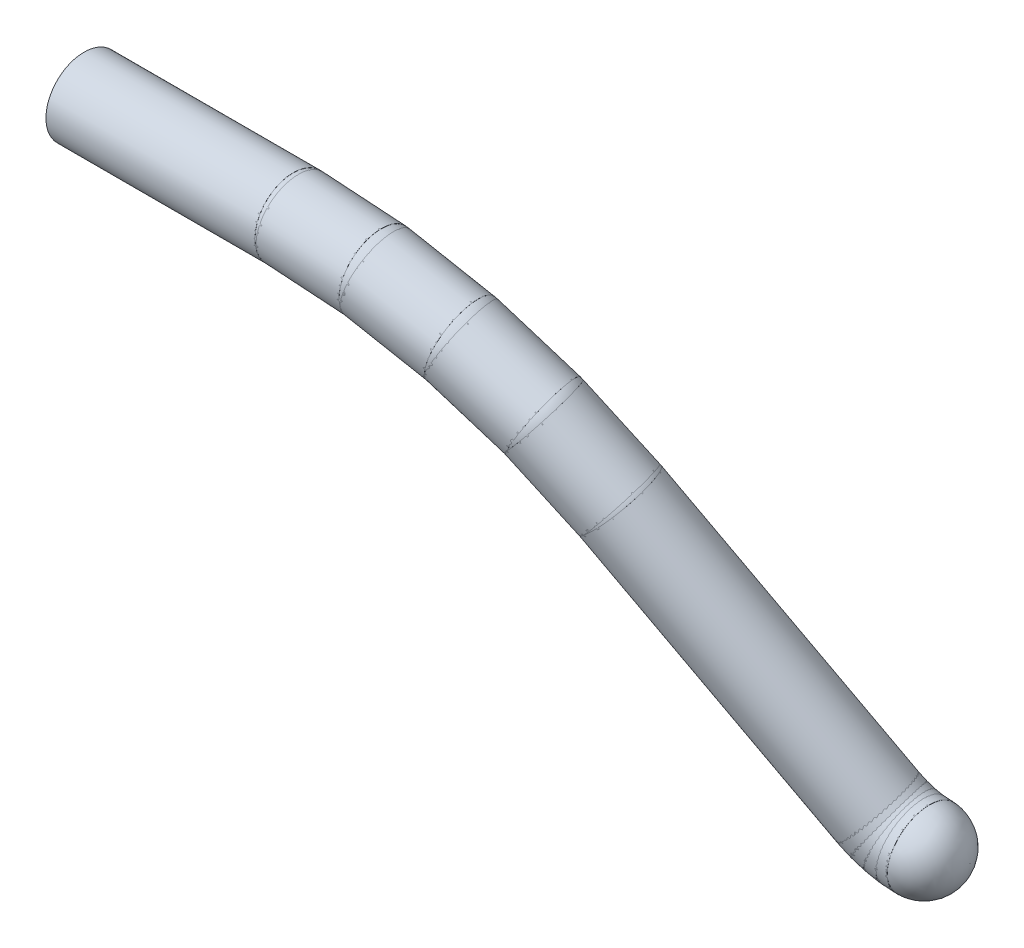
ISO-10303-21;
HEADER;
FILE_DESCRIPTION(('STEP AP214'),'2;1');
FILE_NAME('part.step','',(''),(''),'','','');
FILE_SCHEMA(('AUTOMOTIVE_DESIGN { 1 0 10303 214 1 1 1 1 }'));
ENDSEC;
DATA;
#1=APPLICATION_CONTEXT('core data for automotive mechanical design processes');
#2=APPLICATION_PROTOCOL_DEFINITION('international standard','automotive_design',2000,#1);
#3=PRODUCT_CONTEXT('',#1,'mechanical');
#4=PRODUCT('Part','Part','',(#3));
#5=PRODUCT_RELATED_PRODUCT_CATEGORY('part','',(#4));
#6=PRODUCT_DEFINITION_FORMATION('','',#4);
#7=PRODUCT_DEFINITION_CONTEXT('part definition',#1,'design');
#8=PRODUCT_DEFINITION('design','',#6,#7);
#9=PRODUCT_DEFINITION_SHAPE('','',#8);
#10=(LENGTH_UNIT() NAMED_UNIT(*) SI_UNIT(.MILLI.,.METRE.));
#11=(NAMED_UNIT(*) PLANE_ANGLE_UNIT() SI_UNIT($,.RADIAN.));
#12=(NAMED_UNIT(*) SI_UNIT($,.STERADIAN.) SOLID_ANGLE_UNIT());
#13=UNCERTAINTY_MEASURE_WITH_UNIT(LENGTH_MEASURE(1.E-05),#10,'distance_accuracy_value','');
#14=(GEOMETRIC_REPRESENTATION_CONTEXT(3) GLOBAL_UNCERTAINTY_ASSIGNED_CONTEXT((#13)) GLOBAL_UNIT_ASSIGNED_CONTEXT((#10,
#11,#12)) REPRESENTATION_CONTEXT('',''));
#15=CARTESIAN_POINT('',(0.,0.,0.));
#16=DIRECTION('',(0.,0.,1.));
#17=DIRECTION('',(1.,0.,0.));
#18=AXIS2_PLACEMENT_3D('',#15,#16,#17);
#19=CARTESIAN_POINT('',(59.8,-60.8,197.6));
#20=DIRECTION('',(-1.,0.,0.));
#21=DIRECTION('',(0.,0.,1.));
#22=AXIS2_PLACEMENT_3D('',#19,#20,#21);
#23=PLANE('',#22);
#24=CARTESIAN_POINT('',(59.8,-60.8,197.6));
#25=DIRECTION('',(-1.,0.,0.));
#26=DIRECTION('',(0.,0.,-1.));
#27=AXIS2_PLACEMENT_3D('',#24,#25,#26);
#28=CIRCLE('',#27,2.3);
#29=CARTESIAN_POINT('',(59.8,-60.8,195.3));
#30=VERTEX_POINT('',#29);
#31=EDGE_CURVE('P0_E11',#30,#30,#28,.T.);
#32=ORIENTED_EDGE('',*,*,#31,.F.);
#33=EDGE_LOOP('',(#32));
#34=FACE_BOUND('',#33,.T.);
#35=ADVANCED_FACE('P0_F16',(#34),#23,.F.);
#36=CARTESIAN_POINT('',(59.77,-60.8,197.6));
#37=DIRECTION('',(-1.,0.,0.));
#38=DIRECTION('',(0.,0.,1.));
#39=AXIS2_PLACEMENT_3D('',#36,#37,#38);
#40=PLANE('',#39);
#41=CARTESIAN_POINT('',(59.77,-60.8,197.6));
#42=DIRECTION('',(-1.,0.,0.));
#43=DIRECTION('',(0.,0.,-1.));
#44=AXIS2_PLACEMENT_3D('',#41,#42,#43);
#45=CIRCLE('',#44,2.3);
#46=CARTESIAN_POINT('',(59.77,-60.8,195.3));
#47=VERTEX_POINT('',#46);
#48=EDGE_CURVE('P0_E42',#47,#47,#45,.T.);
#49=ORIENTED_EDGE('',*,*,#48,.T.);
#50=EDGE_LOOP('',(#49));
#51=FACE_BOUND('',#50,.T.);
#52=ADVANCED_FACE('P0_F18',(#51),#40,.T.);
#53=CARTESIAN_POINT('',(59.8,-60.8,197.6));
#54=DIRECTION('',(-1.,0.,0.));
#55=DIRECTION('',(0.,0.,-1.));
#56=AXIS2_PLACEMENT_3D('',#53,#54,#55);
#57=CYLINDRICAL_SURFACE('',#56,2.3);
#58=ORIENTED_EDGE('',*,*,#48,.F.);
#59=DIRECTION('',(-1.,0.,0.));
#60=VECTOR('',#59,1.);
#61=CARTESIAN_POINT('',(59.8,-60.8,195.3));
#62=LINE('',#61,#60);
#63=EDGE_CURVE('P0_E20',#30,#47,#62,.T.);
#64=ORIENTED_EDGE('',*,*,#63,.F.);
#65=ORIENTED_EDGE('',*,*,#31,.T.);
#66=ORIENTED_EDGE('',*,*,#63,.T.);
#67=EDGE_LOOP('',(#58,#64,#65,#66));
#68=FACE_BOUND('',#67,.T.);
#69=ADVANCED_FACE('P0_F41',(#68),#57,.T.);
#70=CLOSED_SHELL('',(#35,#52,#69));
#71=MANIFOLD_SOLID_BREP('P0_B1',#70);
#72=CARTESIAN_POINT('',(59.77,-60.8,197.6));
#73=DIRECTION('',(-0.994377307166138,0.100509124393014,0.0333419691495447));
#74=DIRECTION('',(0.0335116676568446,0.,0.999438326326771));
#75=AXIS2_PLACEMENT_3D('',#72,#73,#74);
#76=PLANE('',#75);
#77=CARTESIAN_POINT('',(59.77,-60.8,197.6));
#78=DIRECTION('',(-0.994377307166163,0.100509124392765,0.0333419691495447));
#79=DIRECTION('',(-0.100565038355,-0.994930486547004,0.));
#80=AXIS2_PLACEMENT_3D('',#77,#78,#79);
#81=CIRCLE('',#80,2.3);
#82=CARTESIAN_POINT('',(59.538700411783,-63.08834011905,197.6));
#83=VERTEX_POINT('',#82);
#84=EDGE_CURVE('P1_E11',#83,#83,#81,.T.);
#85=ORIENTED_EDGE('',*,*,#84,.F.);
#86=EDGE_LOOP('',(#85));
#87=FACE_BOUND('',#86,.T.);
#88=ADVANCED_FACE('P1_F16',(#87),#76,.F.);
#89=CARTESIAN_POINT('',(59.084830912849,-60.73074485458,197.62297406266));
#90=DIRECTION('',(-0.994377307166138,0.100509124393014,0.0333419691495447));
#91=DIRECTION('',(0.0335116676568446,0.,0.999438326326771));
#92=AXIS2_PLACEMENT_3D('',#89,#90,#91);
#93=PLANE('',#92);
#94=CARTESIAN_POINT('',(59.084830912849,-60.73074485458,197.62297406266));
#95=DIRECTION('',(-0.994377307166163,0.100509124392765,0.0333419691495447));
#96=DIRECTION('',(-0.100565038355,-0.994930486547004,0.));
#97=AXIS2_PLACEMENT_3D('',#94,#95,#96);
#98=CIRCLE('',#97,2.3);
#99=CARTESIAN_POINT('',(58.853531324632,-63.01908497363,197.62297406266));
#100=VERTEX_POINT('',#99);
#101=EDGE_CURVE('P1_E20',#100,#100,#98,.T.);
#102=ORIENTED_EDGE('',*,*,#101,.T.);
#103=EDGE_LOOP('',(#102));
#104=FACE_BOUND('',#103,.T.);
#105=ADVANCED_FACE('P1_F44',(#104),#93,.T.);
#106=CARTESIAN_POINT('',(59.77,-60.8,197.6));
#107=DIRECTION('',(-0.994377307166163,0.100509124392765,0.0333419691495447));
#108=DIRECTION('',(-0.100565038355,-0.994930486547004,0.));
#109=AXIS2_PLACEMENT_3D('',#106,#107,#108);
#110=CYLINDRICAL_SURFACE('',#109,2.3);
#111=ORIENTED_EDGE('',*,*,#101,.F.);
#112=DIRECTION('',(-0.994377307166138,0.100509124393014,0.0333419691495447));
#113=VECTOR('',#112,1.);
#114=CARTESIAN_POINT('',(59.538700411783,-63.08834011905,197.6));
#115=LINE('',#114,#113);
#116=EDGE_CURVE('P1_E26',#83,#100,#115,.T.);
#117=ORIENTED_EDGE('',*,*,#116,.F.);
#118=ORIENTED_EDGE('',*,*,#84,.T.);
#119=ORIENTED_EDGE('',*,*,#116,.T.);
#120=EDGE_LOOP('',(#111,#117,#118,#119));
#121=FACE_BOUND('',#120,.T.);
#122=ADVANCED_FACE('P1_F18',(#121),#110,.T.);
#123=CLOSED_SHELL('',(#88,#105,#122));
#124=MANIFOLD_SOLID_BREP('P1_B1',#123);
#125=CARTESIAN_POINT('',(59.084830912849,-60.73074485458,197.62297406266));
#126=DIRECTION('',(-0.949774429553361,0.297019027964113,0.0985303506227474));
#127=DIRECTION('',(0.103187019804501,0.,0.994661972201544));
#128=AXIS2_PLACEMENT_3D('',#125,#126,#127);
#129=PLANE('',#128);
#130=CARTESIAN_POINT('',(59.084830912849,-60.73074485458,197.62297406266));
#131=DIRECTION('',(-0.949774429553291,0.297019027964335,0.0985303506227475));
#132=DIRECTION('',(-0.298471375875002,-0.954418586252009,0.));
#133=AXIS2_PLACEMENT_3D('',#130,#131,#132);
#134=CIRCLE('',#133,2.3);
#135=CARTESIAN_POINT('',(58.398346748337,-62.92590760295,197.62297406266));
#136=VERTEX_POINT('',#135);
#137=EDGE_CURVE('P2_E11',#136,#136,#134,.T.);
#138=ORIENTED_EDGE('',*,*,#137,.F.);
#139=EDGE_LOOP('',(#138));
#140=FACE_BOUND('',#139,.T.);
#141=ADVANCED_FACE('P2_F16',(#140),#129,.F.);
#142=CARTESIAN_POINT('',(58.430395142637,-60.52608586368,197.69086574714));
#143=DIRECTION('',(-0.949774429553361,0.297019027964113,0.0985303506227474));
#144=DIRECTION('',(0.103187019804501,0.,0.994661972201544));
#145=AXIS2_PLACEMENT_3D('',#142,#143,#144);
#146=PLANE('',#145);
#147=CARTESIAN_POINT('',(58.430395142637,-60.52608586368,197.69086574714));
#148=DIRECTION('',(-0.949774429553291,0.297019027964335,0.0985303506227475));
#149=DIRECTION('',(-0.298471375875002,-0.954418586252009,0.));
#150=AXIS2_PLACEMENT_3D('',#147,#148,#149);
#151=CIRCLE('',#150,2.3);
#152=CARTESIAN_POINT('',(57.743910978126,-62.72124861206,197.69086574714));
#153=VERTEX_POINT('',#152);
#154=EDGE_CURVE('P2_E19',#153,#153,#151,.T.);
#155=ORIENTED_EDGE('',*,*,#154,.T.);
#156=EDGE_LOOP('',(#155));
#157=FACE_BOUND('',#156,.T.);
#158=ADVANCED_FACE('P2_F44',(#157),#146,.T.);
#159=CARTESIAN_POINT('',(59.084830912849,-60.73074485458,197.62297406266));
#160=DIRECTION('',(-0.949774429553291,0.297019027964335,0.0985303506227475));
#161=DIRECTION('',(-0.298471375875002,-0.954418586252009,0.));
#162=AXIS2_PLACEMENT_3D('',#159,#160,#161);
#163=CYLINDRICAL_SURFACE('',#162,2.3);
#164=ORIENTED_EDGE('',*,*,#154,.F.);
#165=DIRECTION('',(-0.949774429553361,0.297019027964113,0.0985303506227474));
#166=VECTOR('',#165,1.);
#167=CARTESIAN_POINT('',(58.398346748337,-62.92590760295,197.62297406266));
#168=LINE('',#167,#166);
#169=EDGE_CURVE('P2_E25',#136,#153,#168,.T.);
#170=ORIENTED_EDGE('',*,*,#169,.F.);
#171=ORIENTED_EDGE('',*,*,#137,.T.);
#172=ORIENTED_EDGE('',*,*,#169,.T.);
#173=EDGE_LOOP('',(#164,#170,#171,#172));
#174=FACE_BOUND('',#173,.T.);
#175=ADVANCED_FACE('P2_F40',(#174),#163,.T.);
#176=CLOSED_SHELL('',(#141,#158,#175));
#177=MANIFOLD_SOLID_BREP('P2_B1',#176);
#178=CARTESIAN_POINT('',(58.430395142637,-60.52608586368,197.69086574714));
#179=DIRECTION('',(-0.8625693401485,0.480206118094722,0.159299144944908));
#180=DIRECTION('',(0.181608748444741,0.,0.983370867215587));
#181=AXIS2_PLACEMENT_3D('',#178,#179,#180);
#182=PLANE('',#181);
#183=CARTESIAN_POINT('',(58.430395142637,-60.52608586368,197.69086574714));
#184=DIRECTION('',(-0.86256934014843,0.480206118094849,0.159299144944907));
#185=DIRECTION('',(-0.486417494708771,-0.873726513756589,0.));
#186=AXIS2_PLACEMENT_3D('',#183,#184,#185);
#187=CIRCLE('',#186,2.3);
#188=CARTESIAN_POINT('',(57.311634904808,-62.53565684532,197.69086574714));
#189=VERTEX_POINT('',#188);
#190=EDGE_CURVE('P3_E11',#189,#189,#187,.T.);
#191=ORIENTED_EDGE('',*,*,#190,.F.);
#192=EDGE_LOOP('',(#191));
#193=FACE_BOUND('',#192,.T.);
#194=ADVANCED_FACE('P3_F16',(#193),#182,.F.);
#195=CARTESIAN_POINT('',(57.836047460792,-60.19520302352,197.80062976623));
#196=DIRECTION('',(-0.8625693401485,0.480206118094722,0.159299144944908));
#197=DIRECTION('',(0.181608748444741,0.,0.983370867215587));
#198=AXIS2_PLACEMENT_3D('',#195,#196,#197);
#199=PLANE('',#198);
#200=CARTESIAN_POINT('',(57.836047460792,-60.19520302352,197.80062976623));
#201=DIRECTION('',(-0.86256934014843,0.480206118094849,0.159299144944907));
#202=DIRECTION('',(-0.486417494708771,-0.873726513756589,0.));
#203=AXIS2_PLACEMENT_3D('',#200,#201,#202);
#204=CIRCLE('',#203,2.3);
#205=CARTESIAN_POINT('',(56.717287222962,-62.20477400516,197.80062976623));
#206=VERTEX_POINT('',#205);
#207=EDGE_CURVE('P3_E20',#206,#206,#204,.T.);
#208=ORIENTED_EDGE('',*,*,#207,.T.);
#209=EDGE_LOOP('',(#208));
#210=FACE_BOUND('',#209,.T.);
#211=ADVANCED_FACE('P3_F44',(#210),#199,.T.);
#212=CARTESIAN_POINT('',(58.430395142637,-60.52608586368,197.69086574714));
#213=DIRECTION('',(-0.86256934014843,0.480206118094849,0.159299144944907));
#214=DIRECTION('',(-0.486417494708771,-0.873726513756589,0.));
#215=AXIS2_PLACEMENT_3D('',#212,#213,#214);
#216=CYLINDRICAL_SURFACE('',#215,2.3);
#217=ORIENTED_EDGE('',*,*,#207,.F.);
#218=DIRECTION('',(-0.8625693401485,0.480206118094722,0.159299144944908));
#219=VECTOR('',#218,1.);
#220=CARTESIAN_POINT('',(57.311634904808,-62.53565684532,197.69086574714));
#221=LINE('',#220,#219);
#222=EDGE_CURVE('P3_E27',#189,#206,#221,.T.);
#223=ORIENTED_EDGE('',*,*,#222,.F.);
#224=ORIENTED_EDGE('',*,*,#190,.T.);
#225=ORIENTED_EDGE('',*,*,#222,.T.);
#226=EDGE_LOOP('',(#217,#223,#224,#225));
#227=FACE_BOUND('',#226,.T.);
#228=ADVANCED_FACE('P3_F18',(#227),#216,.T.);
#229=CLOSED_SHELL('',(#194,#211,#228));
#230=MANIFOLD_SOLID_BREP('P3_B1',#229);
#231=CARTESIAN_POINT('',(57.836047460792,-60.19520302352,197.80062976623));
#232=DIRECTION('',(-0.736673630559924,0.641853522473934,0.212922562743978));
#233=DIRECTION('',(0.27766691694419,0.,0.96067740851688));
#234=AXIS2_PLACEMENT_3D('',#231,#232,#233);
#235=PLANE('',#234);
#236=CARTESIAN_POINT('',(57.836047460792,-60.19520302352,197.80062976623));
#237=DIRECTION('',(-0.736673630559779,0.641853522474101,0.212922562743978));
#238=DIRECTION('',(-0.656917240788738,-0.753962690558699,0.));
#239=AXIS2_PLACEMENT_3D('',#236,#237,#238);
#240=CIRCLE('',#239,2.3);
#241=CARTESIAN_POINT('',(56.325137806978,-61.92931721181,197.80062976623));
#242=VERTEX_POINT('',#241);
#243=EDGE_CURVE('P4_E11',#242,#242,#240,.T.);
#244=ORIENTED_EDGE('',*,*,#243,.F.);
#245=EDGE_LOOP('',(#244));
#246=FACE_BOUND('',#245,.T.);
#247=ADVANCED_FACE('P4_F16',(#246),#235,.F.);
#248=CARTESIAN_POINT('',(57.32844738249,-59.7529381117,197.94734264563));
#249=DIRECTION('',(-0.736673630559924,0.641853522473934,0.212922562743978));
#250=DIRECTION('',(0.27766691694419,0.,0.96067740851688));
#251=AXIS2_PLACEMENT_3D('',#248,#249,#250);
#252=PLANE('',#251);
#253=CARTESIAN_POINT('',(57.32844738249,-59.7529381117,197.94734264563));
#254=DIRECTION('',(-0.736673630559779,0.641853522474101,0.212922562743978));
#255=DIRECTION('',(-0.656917240788738,-0.753962690558699,0.));
#256=AXIS2_PLACEMENT_3D('',#253,#254,#255);
#257=CIRCLE('',#256,2.3);
#258=CARTESIAN_POINT('',(55.817537728676,-61.48705229998,197.94734264563));
#259=VERTEX_POINT('',#258);
#260=EDGE_CURVE('P4_E41',#259,#259,#257,.T.);
#261=ORIENTED_EDGE('',*,*,#260,.T.);
#262=EDGE_LOOP('',(#261));
#263=FACE_BOUND('',#262,.T.);
#264=ADVANCED_FACE('P4_F18',(#263),#252,.T.);
#265=CARTESIAN_POINT('',(57.836047460792,-60.19520302352,197.80062976623));
#266=DIRECTION('',(-0.736673630559779,0.641853522474101,0.212922562743978));
#267=DIRECTION('',(-0.656917240788738,-0.753962690558699,0.));
#268=AXIS2_PLACEMENT_3D('',#265,#266,#267);
#269=CYLINDRICAL_SURFACE('',#268,2.3);
#270=ORIENTED_EDGE('',*,*,#260,.F.);
#271=DIRECTION('',(-0.736673630559924,0.641853522473934,0.212922562743978));
#272=VECTOR('',#271,1.);
#273=CARTESIAN_POINT('',(56.325137806978,-61.92931721181,197.80062976623));
#274=LINE('',#273,#272);
#275=EDGE_CURVE('P4_E25',#242,#259,#274,.T.);
#276=ORIENTED_EDGE('',*,*,#275,.F.);
#277=ORIENTED_EDGE('',*,*,#243,.T.);
#278=ORIENTED_EDGE('',*,*,#275,.T.);
#279=EDGE_LOOP('',(#270,#276,#277,#278));
#280=FACE_BOUND('',#279,.T.);
#281=ADVANCED_FACE('P4_F40',(#280),#269,.T.);
#282=CLOSED_SHELL('',(#247,#264,#281));
#283=MANIFOLD_SOLID_BREP('P4_B1',#282);
#284=CARTESIAN_POINT('',(57.32844738249,-59.7529381117,197.94734264563));
#285=DIRECTION('',(-0.660920147965737,0.712286998843717,0.236287514039906));
#286=DIRECTION('',(0.336645450713548,0.,0.941631478081459));
#287=AXIS2_PLACEMENT_3D('',#284,#285,#286);
#288=PLANE('',#287);
#289=CARTESIAN_POINT('',(57.32844738249,-59.7529381117,197.94734264563));
#290=DIRECTION('',(-0.660920147966001,0.712286998843472,0.236287514039906));
#291=DIRECTION('',(0.733044484386062,0.680180699455058,0.));
#292=AXIS2_PLACEMENT_3D('',#289,#290,#291);
#293=CIRCLE('',#292,2.3);
#294=CARTESIAN_POINT('',(59.014449696579,-58.18852250295,197.94734264563));
#295=VERTEX_POINT('',#294);
#296=EDGE_CURVE('P5_E11',#295,#295,#293,.T.);
#297=ORIENTED_EDGE('',*,*,#296,.F.);
#298=EDGE_LOOP('',(#297));
#299=FACE_BOUND('',#298,.T.);
#300=ADVANCED_FACE('P5_F16',(#299),#288,.F.);
#301=CARTESIAN_POINT('',(45.868366214026,-47.40217705967,202.04447011001));
#302=DIRECTION('',(-0.660920147965737,0.712286998843717,0.236287514039906));
#303=DIRECTION('',(0.336645450713548,0.,0.941631478081459));
#304=AXIS2_PLACEMENT_3D('',#301,#302,#303);
#305=PLANE('',#304);
#306=CARTESIAN_POINT('',(45.868366214026,-47.40217705967,202.04447011001));
#307=DIRECTION('',(-0.660920147966001,0.712286998843472,0.236287514039906));
#308=DIRECTION('',(0.733044484386062,0.680180699455058,0.));
#309=AXIS2_PLACEMENT_3D('',#306,#307,#308);
#310=CIRCLE('',#309,2.3);
#311=CARTESIAN_POINT('',(47.554368528115,-45.83776145093,202.04447011001));
#312=VERTEX_POINT('',#311);
#313=EDGE_CURVE('P5_E20',#312,#312,#310,.T.);
#314=ORIENTED_EDGE('',*,*,#313,.T.);
#315=EDGE_LOOP('',(#314));
#316=FACE_BOUND('',#315,.T.);
#317=ADVANCED_FACE('P5_F18',(#316),#305,.T.);
#318=CARTESIAN_POINT('',(57.32844738249,-59.7529381117,197.94734264563));
#319=DIRECTION('',(-0.660920147966001,0.712286998843473,0.236287514039906));
#320=DIRECTION('',(0.733044484386062,0.680180699455058,0.));
#321=AXIS2_PLACEMENT_3D('',#318,#319,#320);
#322=CYLINDRICAL_SURFACE('',#321,2.3);
#323=ORIENTED_EDGE('',*,*,#313,.F.);
#324=DIRECTION('',(-0.660920147965737,0.712286998843717,0.236287514039906));
#325=VECTOR('',#324,1.);
#326=CARTESIAN_POINT('',(59.014449696579,-58.18852250295,197.94734264563));
#327=LINE('',#326,#325);
#328=EDGE_CURVE('P5_E27',#295,#312,#327,.T.);
#329=ORIENTED_EDGE('',*,*,#328,.F.);
#330=ORIENTED_EDGE('',*,*,#296,.T.);
#331=ORIENTED_EDGE('',*,*,#328,.T.);
#332=EDGE_LOOP('',(#323,#329,#330,#331));
#333=FACE_BOUND('',#332,.T.);
#334=ADVANCED_FACE('P5_F41',(#333),#322,.T.);
#335=CLOSED_SHELL('',(#300,#317,#334));
#336=MANIFOLD_SOLID_BREP('P5_B1',#335);
#337=CARTESIAN_POINT('',(45.868366214026,-47.40217705967,202.04447011001));
#338=DIRECTION('',(-0.736673630559924,0.641853522473934,0.212922562743978));
#339=DIRECTION('',(0.27766691694419,0.,0.96067740851688));
#340=AXIS2_PLACEMENT_3D('',#337,#338,#339);
#341=PLANE('',#340);
#342=CARTESIAN_POINT('',(45.868366214026,-47.40217705967,202.04447011001));
#343=DIRECTION('',(-0.736673630559779,0.641853522474101,0.212922562743978));
#344=DIRECTION('',(-0.656917240788738,-0.753962690558699,0.));
#345=AXIS2_PLACEMENT_3D('',#342,#343,#344);
#346=CIRCLE('',#345,2.3);
#347=CARTESIAN_POINT('',(44.357456560212,-49.13629124796,202.04447011001));
#348=VERTEX_POINT('',#347);
#349=EDGE_CURVE('P6_E11',#348,#348,#346,.T.);
#350=ORIENTED_EDGE('',*,*,#349,.F.);
#351=EDGE_LOOP('',(#350));
#352=FACE_BOUND('',#351,.T.);
#353=ADVANCED_FACE('P6_F16',(#352),#341,.F.);
#354=CARTESIAN_POINT('',(42.279900530119,-44.2755966529,203.08165303341));
#355=DIRECTION('',(-0.736673630559924,0.641853522473934,0.212922562743978));
#356=DIRECTION('',(0.27766691694419,0.,0.96067740851688));
#357=AXIS2_PLACEMENT_3D('',#354,#355,#356);
#358=PLANE('',#357);
#359=CARTESIAN_POINT('',(42.279900530119,-44.2755966529,203.08165303341));
#360=DIRECTION('',(-0.736673630559779,0.641853522474101,0.212922562743978));
#361=DIRECTION('',(-0.656917240788738,-0.753962690558699,0.));
#362=AXIS2_PLACEMENT_3D('',#359,#360,#361);
#363=CIRCLE('',#362,2.3);
#364=CARTESIAN_POINT('',(40.768990876305,-46.00971084118,203.08165303341));
#365=VERTEX_POINT('',#364);
#366=EDGE_CURVE('P6_E41',#365,#365,#363,.T.);
#367=ORIENTED_EDGE('',*,*,#366,.T.);
#368=EDGE_LOOP('',(#367));
#369=FACE_BOUND('',#368,.T.);
#370=ADVANCED_FACE('P6_F44',(#369),#358,.T.);
#371=CARTESIAN_POINT('',(45.868366214026,-47.40217705967,202.04447011001));
#372=DIRECTION('',(-0.736673630559779,0.641853522474101,0.212922562743978));
#373=DIRECTION('',(-0.656917240788738,-0.753962690558699,0.));
#374=AXIS2_PLACEMENT_3D('',#371,#372,#373);
#375=CYLINDRICAL_SURFACE('',#374,2.3);
#376=ORIENTED_EDGE('',*,*,#366,.F.);
#377=DIRECTION('',(-0.736673630559924,0.641853522473934,0.212922562743978));
#378=VECTOR('',#377,1.);
#379=CARTESIAN_POINT('',(44.357456560212,-49.13629124796,202.04447011001));
#380=LINE('',#379,#378);
#381=EDGE_CURVE('P6_E20',#348,#365,#380,.T.);
#382=ORIENTED_EDGE('',*,*,#381,.F.);
#383=ORIENTED_EDGE('',*,*,#349,.T.);
#384=ORIENTED_EDGE('',*,*,#381,.T.);
#385=EDGE_LOOP('',(#376,#382,#383,#384));
#386=FACE_BOUND('',#385,.T.);
#387=ADVANCED_FACE('P6_F18',(#386),#375,.T.);
#388=CLOSED_SHELL('',(#353,#370,#387));
#389=MANIFOLD_SOLID_BREP('P6_B1',#388);
#390=CARTESIAN_POINT('',(42.279900530119,-44.2755966529,203.08165303341));
#391=DIRECTION('',(-0.8625693401485,0.480206118094722,0.159299144944908));
#392=DIRECTION('',(0.181608748444741,0.,0.983370867215587));
#393=AXIS2_PLACEMENT_3D('',#390,#391,#392);
#394=PLANE('',#393);
#395=CARTESIAN_POINT('',(42.279900530119,-44.2755966529,203.08165303341));
#396=DIRECTION('',(-0.86256934014843,0.480206118094849,0.159299144944907));
#397=DIRECTION('',(-0.486417494708771,-0.873726513756589,0.));
#398=AXIS2_PLACEMENT_3D('',#395,#396,#397);
#399=CIRCLE('',#398,2.3);
#400=CARTESIAN_POINT('',(41.16114029229,-46.28516763454,203.08165303341));
#401=VERTEX_POINT('',#400);
#402=EDGE_CURVE('P7_E11',#401,#401,#399,.T.);
#403=ORIENTED_EDGE('',*,*,#402,.F.);
#404=EDGE_LOOP('',(#403));
#405=FACE_BOUND('',#404,.T.);
#406=ADVANCED_FACE('P7_F16',(#405),#394,.F.);
#407=CARTESIAN_POINT('',(38.078174896529,-41.93642893398,203.85762694016));
#408=DIRECTION('',(-0.8625693401485,0.480206118094722,0.159299144944908));
#409=DIRECTION('',(0.181608748444741,0.,0.983370867215587));
#410=AXIS2_PLACEMENT_3D('',#407,#408,#409);
#411=PLANE('',#410);
#412=CARTESIAN_POINT('',(38.078174896529,-41.93642893398,203.85762694016));
#413=DIRECTION('',(-0.86256934014843,0.480206118094849,0.159299144944907));
#414=DIRECTION('',(-0.486417494708771,-0.873726513756589,0.));
#415=AXIS2_PLACEMENT_3D('',#412,#413,#414);
#416=CIRCLE('',#415,2.3);
#417=CARTESIAN_POINT('',(36.959414658699,-43.94599991562,203.85762694016));
#418=VERTEX_POINT('',#417);
#419=EDGE_CURVE('P7_E41',#418,#418,#416,.T.);
#420=ORIENTED_EDGE('',*,*,#419,.T.);
#421=EDGE_LOOP('',(#420));
#422=FACE_BOUND('',#421,.T.);
#423=ADVANCED_FACE('P7_F18',(#422),#411,.T.);
#424=CARTESIAN_POINT('',(42.279900530119,-44.2755966529,203.08165303341));
#425=DIRECTION('',(-0.86256934014843,0.480206118094849,0.159299144944907));
#426=DIRECTION('',(-0.486417494708771,-0.873726513756589,0.));
#427=AXIS2_PLACEMENT_3D('',#424,#425,#426);
#428=CYLINDRICAL_SURFACE('',#427,2.3);
#429=ORIENTED_EDGE('',*,*,#419,.F.);
#430=DIRECTION('',(-0.8625693401485,0.480206118094722,0.159299144944908));
#431=VECTOR('',#430,1.);
#432=CARTESIAN_POINT('',(41.16114029229,-46.28516763454,203.08165303341));
#433=LINE('',#432,#431);
#434=EDGE_CURVE('P7_E26',#401,#418,#433,.T.);
#435=ORIENTED_EDGE('',*,*,#434,.F.);
#436=ORIENTED_EDGE('',*,*,#402,.T.);
#437=ORIENTED_EDGE('',*,*,#434,.T.);
#438=EDGE_LOOP('',(#429,#435,#436,#437));
#439=FACE_BOUND('',#438,.T.);
#440=ADVANCED_FACE('P7_F40',(#439),#428,.T.);
#441=CLOSED_SHELL('',(#406,#423,#440));
#442=MANIFOLD_SOLID_BREP('P7_B1',#441);
#443=CARTESIAN_POINT('',(38.078174896529,-41.93642893398,203.85762694016));
#444=DIRECTION('',(-0.949774429553363,0.297019027964114,0.0985303506227276));
#445=DIRECTION('',(0.103187019804481,0.,0.994661972201546));
#446=AXIS2_PLACEMENT_3D('',#443,#444,#445);
#447=PLANE('',#446);
#448=CARTESIAN_POINT('',(38.078174896529,-41.93642893398,203.85762694016));
#449=DIRECTION('',(-0.949774429553293,0.297019027964336,0.0985303506227277));
#450=DIRECTION('',(-0.298471375875002,-0.954418586252009,0.));
#451=AXIS2_PLACEMENT_3D('',#448,#449,#450);
#452=CIRCLE('',#451,2.3);
#453=CARTESIAN_POINT('',(37.391690732017,-44.13159168236,203.85762694016));
#454=VERTEX_POINT('',#453);
#455=EDGE_CURVE('P8_E11',#454,#454,#452,.T.);
#456=ORIENTED_EDGE('',*,*,#455,.F.);
#457=EDGE_LOOP('',(#456));
#458=FACE_BOUND('',#457,.T.);
#459=ADVANCED_FACE('P8_F16',(#458),#447,.F.);
#460=CARTESIAN_POINT('',(33.451658069376,-40.48959746737,204.33758545553));
#461=DIRECTION('',(-0.949774429553363,0.297019027964114,0.0985303506227276));
#462=DIRECTION('',(0.103187019804481,0.,0.994661972201546));
#463=AXIS2_PLACEMENT_3D('',#460,#461,#462);
#464=PLANE('',#463);
#465=CARTESIAN_POINT('',(33.451658069376,-40.48959746737,204.33758545553));
#466=DIRECTION('',(-0.949774429553293,0.297019027964336,0.0985303506227277));
#467=DIRECTION('',(-0.298471375875002,-0.954418586252009,0.));
#468=AXIS2_PLACEMENT_3D('',#465,#466,#467);
#469=CIRCLE('',#468,2.3);
#470=CARTESIAN_POINT('',(32.765173904864,-42.68476021575,204.33758545553));
#471=VERTEX_POINT('',#470);
#472=EDGE_CURVE('P8_E19',#471,#471,#469,.T.);
#473=ORIENTED_EDGE('',*,*,#472,.T.);
#474=EDGE_LOOP('',(#473));
#475=FACE_BOUND('',#474,.T.);
#476=ADVANCED_FACE('P8_F44',(#475),#464,.T.);
#477=CARTESIAN_POINT('',(38.078174896529,-41.93642893398,203.85762694016));
#478=DIRECTION('',(-0.949774429553293,0.297019027964336,0.0985303506227277));
#479=DIRECTION('',(-0.298471375875002,-0.954418586252009,0.));
#480=AXIS2_PLACEMENT_3D('',#477,#478,#479);
#481=CYLINDRICAL_SURFACE('',#480,2.3);
#482=ORIENTED_EDGE('',*,*,#472,.F.);
#483=DIRECTION('',(-0.949774429553363,0.297019027964114,0.0985303506227276));
#484=VECTOR('',#483,1.);
#485=CARTESIAN_POINT('',(37.391690732017,-44.13159168236,203.85762694016));
#486=LINE('',#485,#484);
#487=EDGE_CURVE('P8_E25',#454,#471,#486,.T.);
#488=ORIENTED_EDGE('',*,*,#487,.F.);
#489=ORIENTED_EDGE('',*,*,#455,.T.);
#490=ORIENTED_EDGE('',*,*,#487,.T.);
#491=EDGE_LOOP('',(#482,#488,#489,#490));
#492=FACE_BOUND('',#491,.T.);
#493=ADVANCED_FACE('P8_F40',(#492),#481,.T.);
#494=CLOSED_SHELL('',(#459,#476,#493));
#495=MANIFOLD_SOLID_BREP('P8_B1',#494);
#496=CARTESIAN_POINT('',(33.451658069376,-40.48959746737,204.33758545553));
#497=DIRECTION('',(-0.994377307166138,0.100509124393014,0.0333419691495646));
#498=DIRECTION('',(0.0335116676568647,0.,0.99943832632677));
#499=AXIS2_PLACEMENT_3D('',#496,#497,#498);
#500=PLANE('',#499);
#501=CARTESIAN_POINT('',(33.451658069376,-40.48959746737,204.33758545553));
#502=DIRECTION('',(-0.994377307166163,0.100509124392765,0.0333419691495646));
#503=DIRECTION('',(-0.100565038355,-0.994930486547004,0.));
#504=AXIS2_PLACEMENT_3D('',#501,#502,#503);
#505=CIRCLE('',#504,2.3);
#506=CARTESIAN_POINT('',(33.220358481159,-42.77793758643,204.33758545553));
#507=VERTEX_POINT('',#506);
#508=EDGE_CURVE('P9_E11',#507,#507,#505,.T.);
#509=ORIENTED_EDGE('',*,*,#508,.F.);
#510=EDGE_LOOP('',(#509));
#511=FACE_BOUND('',#510,.T.);
#512=ADVANCED_FACE('P9_F16',(#511),#500,.F.);
#513=CARTESIAN_POINT('',(28.607872849441,-40.,204.5));
#514=DIRECTION('',(-0.994377307166138,0.100509124393014,0.0333419691495646));
#515=DIRECTION('',(0.0335116676568647,0.,0.99943832632677));
#516=AXIS2_PLACEMENT_3D('',#513,#514,#515);
#517=PLANE('',#516);
#518=CARTESIAN_POINT('',(28.607872849441,-40.,204.5));
#519=DIRECTION('',(-0.994377307166163,0.100509124392765,0.0333419691495646));
#520=DIRECTION('',(-0.100565038355,-0.994930486547004,0.));
#521=AXIS2_PLACEMENT_3D('',#518,#519,#520);
#522=CIRCLE('',#521,2.3);
#523=CARTESIAN_POINT('',(28.376573261224,-42.28834011905,204.5));
#524=VERTEX_POINT('',#523);
#525=EDGE_CURVE('P9_E41',#524,#524,#522,.T.);
#526=ORIENTED_EDGE('',*,*,#525,.T.);
#527=EDGE_LOOP('',(#526));
#528=FACE_BOUND('',#527,.T.);
#529=ADVANCED_FACE('P9_F18',(#528),#517,.T.);
#530=CARTESIAN_POINT('',(33.451658069376,-40.48959746737,204.33758545553));
#531=DIRECTION('',(-0.994377307166163,0.100509124392765,0.0333419691495646));
#532=DIRECTION('',(-0.100565038355,-0.994930486547004,0.));
#533=AXIS2_PLACEMENT_3D('',#530,#531,#532);
#534=CYLINDRICAL_SURFACE('',#533,2.3);
#535=ORIENTED_EDGE('',*,*,#525,.F.);
#536=DIRECTION('',(-0.994377307166138,0.100509124393014,0.0333419691495646));
#537=VECTOR('',#536,1.);
#538=CARTESIAN_POINT('',(33.220358481159,-42.77793758643,204.33758545553));
#539=LINE('',#538,#537);
#540=EDGE_CURVE('P9_E26',#507,#524,#539,.T.);
#541=ORIENTED_EDGE('',*,*,#540,.F.);
#542=ORIENTED_EDGE('',*,*,#508,.T.);
#543=ORIENTED_EDGE('',*,*,#540,.T.);
#544=EDGE_LOOP('',(#535,#541,#542,#543));
#545=FACE_BOUND('',#544,.T.);
#546=ADVANCED_FACE('P9_F40',(#545),#534,.T.);
#547=CLOSED_SHELL('',(#512,#529,#546));
#548=MANIFOLD_SOLID_BREP('P9_B1',#547);
#549=CARTESIAN_POINT('',(28.607872849441,-40.,204.5));
#550=DIRECTION('',(-1.,0.,0.));
#551=DIRECTION('',(0.,0.,1.));
#552=AXIS2_PLACEMENT_3D('',#549,#550,#551);
#553=PLANE('',#552);
#554=CARTESIAN_POINT('',(28.607872849441,-40.,204.5));
#555=DIRECTION('',(-1.,0.,0.));
#556=DIRECTION('',(0.,0.,-1.));
#557=AXIS2_PLACEMENT_3D('',#554,#555,#556);
#558=CIRCLE('',#557,2.3);
#559=CARTESIAN_POINT('',(28.607872849441,-40.,202.2));
#560=VERTEX_POINT('',#559);
#561=EDGE_CURVE('P10_E11',#560,#560,#558,.T.);
#562=ORIENTED_EDGE('',*,*,#561,.F.);
#563=EDGE_LOOP('',(#562));
#564=FACE_BOUND('',#563,.T.);
#565=ADVANCED_FACE('P10_F16',(#564),#553,.F.);
#566=CARTESIAN_POINT('',(16.,-40.,204.5));
#567=DIRECTION('',(-1.,0.,0.));
#568=DIRECTION('',(0.,0.,1.));
#569=AXIS2_PLACEMENT_3D('',#566,#567,#568);
#570=PLANE('',#569);
#571=CARTESIAN_POINT('',(16.,-40.,204.5));
#572=DIRECTION('',(-1.,0.,0.));
#573=DIRECTION('',(0.,0.,-1.));
#574=AXIS2_PLACEMENT_3D('',#571,#572,#573);
#575=CIRCLE('',#574,2.3);
#576=CARTESIAN_POINT('',(16.,-40.,202.2));
#577=VERTEX_POINT('',#576);
#578=EDGE_CURVE('P10_E40',#577,#577,#575,.T.);
#579=ORIENTED_EDGE('',*,*,#578,.T.);
#580=EDGE_LOOP('',(#579));
#581=FACE_BOUND('',#580,.T.);
#582=ADVANCED_FACE('P10_F43',(#581),#570,.T.);
#583=CARTESIAN_POINT('',(28.607872849441,-40.,204.5));
#584=DIRECTION('',(-1.,0.,0.));
#585=DIRECTION('',(0.,0.,-1.));
#586=AXIS2_PLACEMENT_3D('',#583,#584,#585);
#587=CYLINDRICAL_SURFACE('',#586,2.3);
#588=ORIENTED_EDGE('',*,*,#578,.F.);
#589=DIRECTION('',(-1.,0.,0.));
#590=VECTOR('',#589,1.);
#591=CARTESIAN_POINT('',(28.607872849441,-40.,202.2));
#592=LINE('',#591,#590);
#593=EDGE_CURVE('P10_E24',#560,#577,#592,.T.);
#594=ORIENTED_EDGE('',*,*,#593,.F.);
#595=ORIENTED_EDGE('',*,*,#561,.T.);
#596=ORIENTED_EDGE('',*,*,#593,.T.);
#597=EDGE_LOOP('',(#588,#594,#595,#596));
#598=FACE_BOUND('',#597,.T.);
#599=ADVANCED_FACE('P10_F39',(#598),#587,.T.);
#600=CLOSED_SHELL('',(#565,#582,#599));
#601=MANIFOLD_SOLID_BREP('P10_B1',#600);
#602=CARTESIAN_POINT('',(59.77,-60.8,197.6));
#603=DIRECTION('',(0.,0.,1.));
#604=DIRECTION('',(1.,0.,0.));
#605=AXIS2_PLACEMENT_3D('',#602,#603,#604);
#606=SPHERICAL_SURFACE('',#605,2.3);
#607=CARTESIAN_POINT('',(59.77,-60.8,195.3));
#608=VERTEX_POINT('',#607);
#609=VERTEX_LOOP('',#608);
#610=FACE_BOUND('',#609,.T.);
#611=ADVANCED_FACE('P11_F14',(#610),#606,.T.);
#612=CLOSED_SHELL('',(#611));
#613=MANIFOLD_SOLID_BREP('P11_B1',#612);
#614=CARTESIAN_POINT('',(59.084830912849,-60.73074485458,197.62297406266));
#615=DIRECTION('',(0.,0.,1.));
#616=DIRECTION('',(1.,0.,0.));
#617=AXIS2_PLACEMENT_3D('',#614,#615,#616);
#618=SPHERICAL_SURFACE('',#617,2.3);
#619=CARTESIAN_POINT('',(59.084830912849,-60.73074485458,195.32297406266));
#620=VERTEX_POINT('',#619);
#621=VERTEX_LOOP('',#620);
#622=FACE_BOUND('',#621,.T.);
#623=ADVANCED_FACE('P12_F14',(#622),#618,.T.);
#624=CLOSED_SHELL('',(#623));
#625=MANIFOLD_SOLID_BREP('P12_B1',#624);
#626=CARTESIAN_POINT('',(58.430395142637,-60.52608586368,197.69086574714));
#627=DIRECTION('',(0.,0.,1.));
#628=DIRECTION('',(1.,0.,0.));
#629=AXIS2_PLACEMENT_3D('',#626,#627,#628);
#630=SPHERICAL_SURFACE('',#629,2.3);
#631=CARTESIAN_POINT('',(58.430395142637,-60.52608586368,195.39086574714));
#632=VERTEX_POINT('',#631);
#633=VERTEX_LOOP('',#632);
#634=FACE_BOUND('',#633,.T.);
#635=ADVANCED_FACE('P13_F14',(#634),#630,.T.);
#636=CLOSED_SHELL('',(#635));
#637=MANIFOLD_SOLID_BREP('P13_B1',#636);
#638=CARTESIAN_POINT('',(57.836047460792,-60.19520302352,197.80062976623));
#639=DIRECTION('',(0.,0.,1.));
#640=DIRECTION('',(1.,0.,0.));
#641=AXIS2_PLACEMENT_3D('',#638,#639,#640);
#642=SPHERICAL_SURFACE('',#641,2.3);
#643=CARTESIAN_POINT('',(57.836047460792,-60.19520302352,195.50062976623));
#644=VERTEX_POINT('',#643);
#645=VERTEX_LOOP('',#644);
#646=FACE_BOUND('',#645,.T.);
#647=ADVANCED_FACE('P14_F14',(#646),#642,.T.);
#648=CLOSED_SHELL('',(#647));
#649=MANIFOLD_SOLID_BREP('P14_B1',#648);
#650=CARTESIAN_POINT('',(57.32844738249,-59.7529381117,197.94734264563));
#651=DIRECTION('',(0.,0.,1.));
#652=DIRECTION('',(1.,0.,0.));
#653=AXIS2_PLACEMENT_3D('',#650,#651,#652);
#654=SPHERICAL_SURFACE('',#653,2.3);
#655=CARTESIAN_POINT('',(57.32844738249,-59.7529381117,195.64734264563));
#656=VERTEX_POINT('',#655);
#657=VERTEX_LOOP('',#656);
#658=FACE_BOUND('',#657,.T.);
#659=ADVANCED_FACE('P15_F14',(#658),#654,.T.);
#660=CLOSED_SHELL('',(#659));
#661=MANIFOLD_SOLID_BREP('P15_B1',#660);
#662=CARTESIAN_POINT('',(45.868366214026,-47.40217705967,202.04447011001));
#663=DIRECTION('',(0.,0.,1.));
#664=DIRECTION('',(1.,0.,0.));
#665=AXIS2_PLACEMENT_3D('',#662,#663,#664);
#666=SPHERICAL_SURFACE('',#665,2.3);
#667=CARTESIAN_POINT('',(45.868366214026,-47.40217705967,199.74447011001));
#668=VERTEX_POINT('',#667);
#669=VERTEX_LOOP('',#668);
#670=FACE_BOUND('',#669,.T.);
#671=ADVANCED_FACE('P16_F14',(#670),#666,.T.);
#672=CLOSED_SHELL('',(#671));
#673=MANIFOLD_SOLID_BREP('P16_B1',#672);
#674=CARTESIAN_POINT('',(42.279900530119,-44.2755966529,203.08165303341));
#675=DIRECTION('',(0.,0.,1.));
#676=DIRECTION('',(1.,0.,0.));
#677=AXIS2_PLACEMENT_3D('',#674,#675,#676);
#678=SPHERICAL_SURFACE('',#677,2.3);
#679=CARTESIAN_POINT('',(42.279900530119,-44.2755966529,200.78165303341));
#680=VERTEX_POINT('',#679);
#681=VERTEX_LOOP('',#680);
#682=FACE_BOUND('',#681,.T.);
#683=ADVANCED_FACE('P17_F14',(#682),#678,.T.);
#684=CLOSED_SHELL('',(#683));
#685=MANIFOLD_SOLID_BREP('P17_B1',#684);
#686=CARTESIAN_POINT('',(38.078174896529,-41.93642893398,203.85762694016));
#687=DIRECTION('',(0.,0.,1.));
#688=DIRECTION('',(1.,0.,0.));
#689=AXIS2_PLACEMENT_3D('',#686,#687,#688);
#690=SPHERICAL_SURFACE('',#689,2.3);
#691=CARTESIAN_POINT('',(38.078174896529,-41.93642893398,201.55762694016));
#692=VERTEX_POINT('',#691);
#693=VERTEX_LOOP('',#692);
#694=FACE_BOUND('',#693,.T.);
#695=ADVANCED_FACE('P18_F14',(#694),#690,.T.);
#696=CLOSED_SHELL('',(#695));
#697=MANIFOLD_SOLID_BREP('P18_B1',#696);
#698=CARTESIAN_POINT('',(33.451658069376,-40.48959746737,204.33758545553));
#699=DIRECTION('',(0.,0.,1.));
#700=DIRECTION('',(1.,0.,0.));
#701=AXIS2_PLACEMENT_3D('',#698,#699,#700);
#702=SPHERICAL_SURFACE('',#701,2.3);
#703=CARTESIAN_POINT('',(33.451658069376,-40.48959746737,202.03758545553));
#704=VERTEX_POINT('',#703);
#705=VERTEX_LOOP('',#704);
#706=FACE_BOUND('',#705,.T.);
#707=ADVANCED_FACE('P19_F14',(#706),#702,.T.);
#708=CLOSED_SHELL('',(#707));
#709=MANIFOLD_SOLID_BREP('P19_B1',#708);
#710=CARTESIAN_POINT('',(28.607872849441,-40.,204.5));
#711=DIRECTION('',(0.,0.,1.));
#712=DIRECTION('',(1.,0.,0.));
#713=AXIS2_PLACEMENT_3D('',#710,#711,#712);
#714=SPHERICAL_SURFACE('',#713,2.3);
#715=CARTESIAN_POINT('',(28.607872849441,-40.,202.2));
#716=VERTEX_POINT('',#715);
#717=VERTEX_LOOP('',#716);
#718=FACE_BOUND('',#717,.T.);
#719=ADVANCED_FACE('P20_F13',(#718),#714,.T.);
#720=CLOSED_SHELL('',(#719));
#721=MANIFOLD_SOLID_BREP('P20_B1',#720);
#722=ADVANCED_BREP_SHAPE_REPRESENTATION('',(#18,#71,#124,#177,#230,#283,#336,#389,#442,#495,
#548,#601,#613,#625,#637,#649,#661,#673,#685,#697,#709,#721),#14);
#723=SHAPE_DEFINITION_REPRESENTATION(#9,#722);
ENDSEC;
END-ISO-10303-21;
